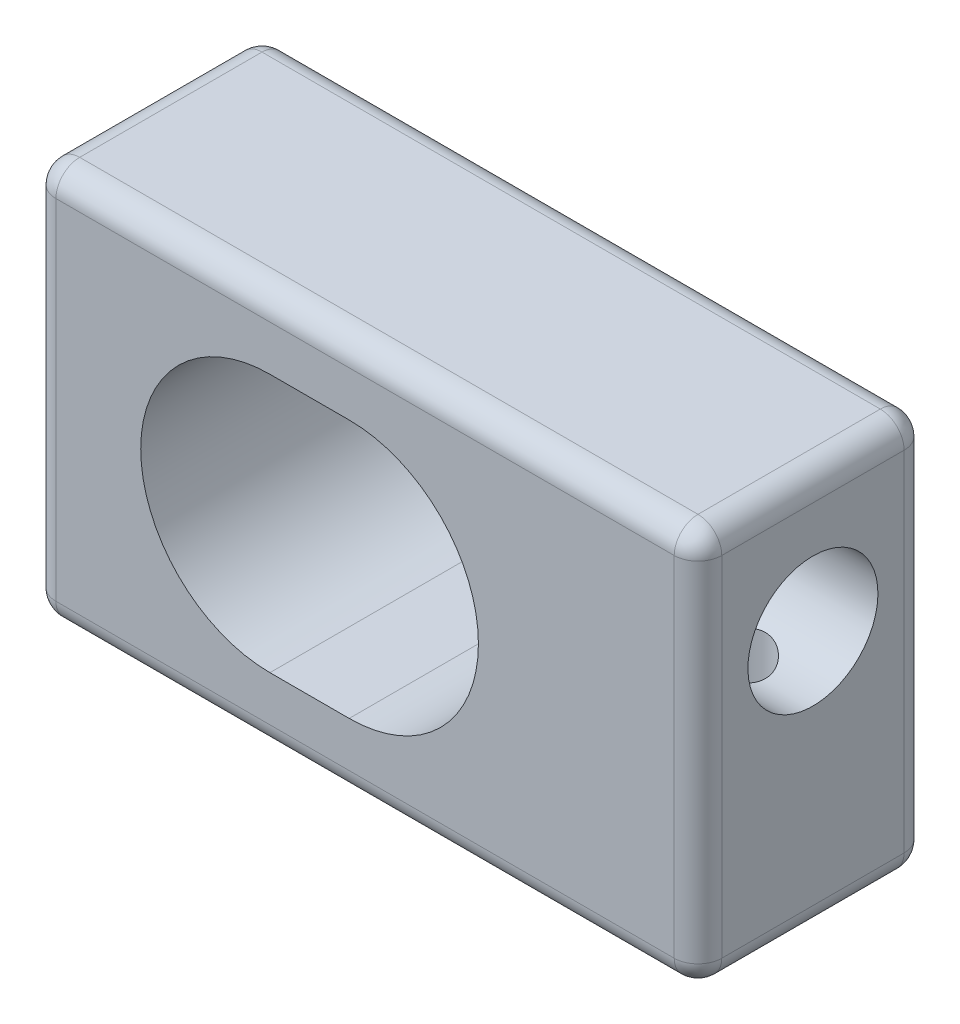
ISO-10303-21;
HEADER;
FILE_DESCRIPTION(('STEP AP214'),'2;1');
FILE_NAME('part.step','',(''),(''),'','','');
FILE_SCHEMA(('AUTOMOTIVE_DESIGN { 1 0 10303 214 1 1 1 1 }'));
ENDSEC;
DATA;
#1=APPLICATION_CONTEXT('core data for automotive mechanical design processes');
#2=APPLICATION_PROTOCOL_DEFINITION('international standard','automotive_design',2000,#1);
#3=PRODUCT_CONTEXT('',#1,'mechanical');
#4=PRODUCT('Part','Part','',(#3));
#5=PRODUCT_RELATED_PRODUCT_CATEGORY('part','',(#4));
#6=PRODUCT_DEFINITION_FORMATION('','',#4);
#7=PRODUCT_DEFINITION_CONTEXT('part definition',#1,'design');
#8=PRODUCT_DEFINITION('design','',#6,#7);
#9=PRODUCT_DEFINITION_SHAPE('','',#8);
#10=(LENGTH_UNIT() NAMED_UNIT(*) SI_UNIT(.MILLI.,.METRE.));
#11=(NAMED_UNIT(*) PLANE_ANGLE_UNIT() SI_UNIT($,.RADIAN.));
#12=(NAMED_UNIT(*) SI_UNIT($,.STERADIAN.) SOLID_ANGLE_UNIT());
#13=UNCERTAINTY_MEASURE_WITH_UNIT(LENGTH_MEASURE(1.E-05),#10,'distance_accuracy_value','');
#14=(GEOMETRIC_REPRESENTATION_CONTEXT(3) GLOBAL_UNCERTAINTY_ASSIGNED_CONTEXT((#13)) GLOBAL_UNIT_ASSIGNED_CONTEXT((#10,
#11,#12)) REPRESENTATION_CONTEXT('',''));
#15=CARTESIAN_POINT('',(0.,0.,0.));
#16=DIRECTION('',(0.,0.,1.));
#17=DIRECTION('',(1.,0.,0.));
#18=AXIS2_PLACEMENT_3D('',#15,#16,#17);
#19=CARTESIAN_POINT('',(-35.,3.99999999999999,0.));
#20=DIRECTION('',(1.,0.,0.));
#21=DIRECTION('',(0.,1.,0.));
#22=AXIS2_PLACEMENT_3D('',#19,#20,#21);
#23=CYLINDRICAL_SURFACE('',#22,4.1);
#24=CARTESIAN_POINT('',(-35.,3.99999999999999,0.));
#25=DIRECTION('',(1.,0.,0.));
#26=DIRECTION('',(0.,1.,0.));
#27=AXIS2_PLACEMENT_3D('',#24,#25,#26);
#28=CIRCLE('',#27,4.1);
#29=CARTESIAN_POINT('',(-35.,8.09999999999999,0.));
#30=VERTEX_POINT('',#29);
#31=EDGE_CURVE('E174',#30,#30,#28,.T.);
#32=ORIENTED_EDGE('',*,*,#31,.F.);
#33=EDGE_LOOP('',(#32));
#34=FACE_BOUND('',#33,.T.);
#35=CARTESIAN_POINT('',(-23.,4.,0.));
#36=DIRECTION('',(1.,0.,0.));
#37=DIRECTION('',(0.,1.,0.));
#38=AXIS2_PLACEMENT_3D('',#35,#36,#37);
#39=CIRCLE('',#38,4.1);
#40=CARTESIAN_POINT('',(-23.,8.1,0.));
#41=VERTEX_POINT('',#40);
#42=EDGE_CURVE('E206',#41,#41,#39,.T.);
#43=ORIENTED_EDGE('',*,*,#42,.T.);
#44=EDGE_LOOP('',(#43));
#45=FACE_BOUND('',#44,.T.);
#46=CARTESIAN_POINT('',(-28.,0.420893966365342,-2.));
#47=CARTESIAN_POINT('',(-28.1046031312725,0.42088450648062,-1.99999203521137));
#48=CARTESIAN_POINT('',(-28.2093511033945,0.416238741594833,-1.99173874982166));
#49=CARTESIAN_POINT('',(-28.4156613049539,0.398314840825055,-1.95912946894205));
#50=CARTESIAN_POINT('',(-28.5172159987745,0.385017688979334,-1.93473799932171));
#51=CARTESIAN_POINT('',(-28.7137725061673,0.351695686234525,-1.87113477427496));
#52=CARTESIAN_POINT('',(-28.8088049497837,0.331705308185981,-1.83199883213511));
#53=CARTESIAN_POINT('',(-28.9909318594943,0.287302034174977,-1.74024799841703));
#54=CARTESIAN_POINT('',(-29.0780262326005,0.262889086415728,-1.68763294896955));
#55=CARTESIAN_POINT('',(-29.2493433023785,0.210052370329995,-1.56558293033315));
#56=CARTESIAN_POINT('',(-29.3328072122269,0.181464228208256,-1.49515355486));
#57=CARTESIAN_POINT('',(-29.4873240306054,0.124827938574249,-1.34154519168278));
#58=CARTESIAN_POINT('',(-29.5583709971796,0.0967800552765653,-1.25836013547559));
#59=CARTESIAN_POINT('',(-29.6904395124954,0.0422559112787271,-1.07515162671652));
#60=CARTESIAN_POINT('',(-29.7505398545859,0.0159920363469842,-0.974394981339269));
#61=CARTESIAN_POINT('',(-29.85259316855,-0.0298904380465804,-0.762680850328953));
#62=CARTESIAN_POINT('',(-29.8945570528376,-0.0495130319139707,-0.651729547528794));
#63=CARTESIAN_POINT('',(-29.9561813505541,-0.0787206237004419,-0.430804292426904));
#64=CARTESIAN_POINT('',(-29.9771688968046,-0.0888994580161855,-0.321280788621113));
#65=CARTESIAN_POINT('',(-30.0006026099949,-0.100280364746837,-0.0998294816190968));
#66=CARTESIAN_POINT('',(-30.003059381806,-0.101487571477558,0.0120969096544417));
#67=CARTESIAN_POINT('',(-29.9899029762825,-0.095081612020624,0.225251375571964));
#68=CARTESIAN_POINT('',(-29.9757703352434,-0.0881910759698528,0.326597393919669));
#69=CARTESIAN_POINT('',(-29.9324682424626,-0.0674406457933107,0.525265987252534));
#70=CARTESIAN_POINT('',(-29.9032976695033,-0.053580232000275,0.62258826164565));
#71=CARTESIAN_POINT('',(-29.8305242701898,-0.0199212488693596,0.812185586111153));
#72=CARTESIAN_POINT('',(-29.7867208177783,-4.05126707999873E-05,0.904368438528107));
#73=CARTESIAN_POINT('',(-29.6861846505913,0.0438434063759527,1.08030473735587));
#74=CARTESIAN_POINT('',(-29.629447244431,0.0678480842739406,1.16405510921946));
#75=CARTESIAN_POINT('',(-29.4987043286489,0.120282427987117,1.32888526806238));
#76=CARTESIAN_POINT('',(-29.4235965795906,0.148915990270962,1.40902672648122));
#77=CARTESIAN_POINT('',(-29.2612141746693,0.205941185577788,1.55606875729569));
#78=CARTESIAN_POINT('',(-29.1739310113431,0.234332634578314,1.62295999143291));
#79=CARTESIAN_POINT('',(-28.9834283131435,0.289426721688105,1.74539879244378));
#80=CARTESIAN_POINT('',(-28.8795767875423,0.315934778736237,1.80005910768764));
#81=CARTESIAN_POINT('',(-28.66254531299,0.361624339903499,1.89072122831643));
#82=CARTESIAN_POINT('',(-28.5493748272999,0.38081316770062,1.92674169782093));
#83=CARTESIAN_POINT('',(-28.3262170381446,0.407628177528897,1.9762603767883));
#84=CARTESIAN_POINT('',(-28.216667887489,0.416038262776381,1.99129373139044));
#85=CARTESIAN_POINT('',(-27.9963141639717,0.42258189009715,2.00303207769182));
#86=CARTESIAN_POINT('',(-27.8855104287216,0.420721926739085,1.99974865253435));
#87=CARTESIAN_POINT('',(-27.6777784001529,0.407764713631274,1.97635544891226));
#88=CARTESIAN_POINT('',(-27.5805844794752,0.397625549218385,1.95798980802438));
#89=CARTESIAN_POINT('',(-27.3908247068405,0.370638900912599,1.90749863988995));
#90=CARTESIAN_POINT('',(-27.2982602771343,0.353789369568627,1.87536891275175));
#91=CARTESIAN_POINT('',(-27.1155148854361,0.314356068437624,1.79667570758734));
#92=CARTESIAN_POINT('',(-27.0256441457537,0.291542376463337,1.74951132085546));
#93=CARTESIAN_POINT('',(-26.8545821910222,0.242974359139307,1.64262069707828));
#94=CARTESIAN_POINT('',(-26.7733954253632,0.217218540180939,1.58288806653124));
#95=CARTESIAN_POINT('',(-26.6119224969456,0.161988276190041,1.44425233541738));
#96=CARTESIAN_POINT('',(-26.5328890101139,0.132435544909155,1.36391485049048));
#97=CARTESIAN_POINT('',(-26.3890577757458,0.0756191529476564,1.1906082774667));
#98=CARTESIAN_POINT('',(-26.3242641198842,0.0483561515850631,1.09763557115075));
#99=CARTESIAN_POINT('',(-26.2096103979044,-0.00159602312270822,0.89885628457633));
#100=CARTESIAN_POINT('',(-26.1601053926224,-0.0241729471476348,0.792814745687152));
#101=CARTESIAN_POINT('',(-26.0801158698428,-0.0613657595981733,0.572492505839614));
#102=CARTESIAN_POINT('',(-26.0496154549233,-0.0759883005958989,0.458218780662892));
#103=CARTESIAN_POINT('',(-26.0110099743409,-0.0946095016729402,0.235637779143145));
#104=CARTESIAN_POINT('',(-26.0011560842486,-0.0994365534491553,0.12770230974768));
#105=CARTESIAN_POINT('',(-25.9990373235048,-0.100469103195134,-0.0883674499714231));
#106=CARTESIAN_POINT('',(-26.0067668824825,-0.0966773315761714,-0.196501666488735));
#107=CARTESIAN_POINT('',(-26.0384085082158,-0.0813808629210031,-0.403000999714162));
#108=CARTESIAN_POINT('',(-26.0613090069554,-0.070358698032761,-0.50156052215356));
#109=CARTESIAN_POINT('',(-26.1213208863698,-0.0421202407472661,-0.693297406779022));
#110=CARTESIAN_POINT('',(-26.1584344020142,-0.0249030177997953,-0.78647395795567));
#111=CARTESIAN_POINT('',(-26.2475467579605,0.0150984854756035,-0.96938710744483));
#112=CARTESIAN_POINT('',(-26.3001285845863,0.0380943432643267,-1.05879207441146));
#113=CARTESIAN_POINT('',(-26.4179383301594,0.0871939300788347,-1.22789007126321));
#114=CARTESIAN_POINT('',(-26.4831720692979,0.113299087317954,-1.30757860376514));
#115=CARTESIAN_POINT('',(-26.6316603081963,0.168919234158771,-1.46296322006606));
#116=CARTESIAN_POINT('',(-26.7160390337754,0.198522285201071,-1.53755746285946));
#117=CARTESIAN_POINT('',(-26.8966151527309,0.255656353469566,-1.67189420349917));
#118=CARTESIAN_POINT('',(-26.9928220687854,0.283185672033318,-1.73162461618753));
#119=CARTESIAN_POINT('',(-27.1976998870936,0.333440532034785,-1.83569855861032));
#120=CARTESIAN_POINT('',(-27.3066179671409,0.35603220676816,-1.87963029930496));
#121=CARTESIAN_POINT('',(-27.4752521582704,0.383058842513929,-1.93082838173293));
#122=CARTESIAN_POINT('',(-27.5322852370427,0.390920182330383,-1.94543783106175));
#123=CARTESIAN_POINT('',(-27.6476908702184,0.404051075848943,-1.969605058563));
#124=CARTESIAN_POINT('',(-27.7060624412519,0.409322472281107,-1.97916642877747));
#125=CARTESIAN_POINT('',(-27.8037857828507,0.415730765501439,-1.99073876092795));
#126=CARTESIAN_POINT('',(-27.8429200708939,0.417662262836336,-1.99420822373664));
#127=CARTESIAN_POINT('',(-27.9213627405276,0.420245681261091,-1.99884041200608));
#128=CARTESIAN_POINT('',(-27.9606711327483,0.420897523109255,-2.00000299461509));
#129=CARTESIAN_POINT('',(-28.,0.420893966365342,-2.));
#130=B_SPLINE_CURVE_WITH_KNOTS('',3,(#46,#47,#48,#49,#50,#51,#52,#53,#54,#55,#56,#57,#58,#59,
#60,#61,#62,#63,#64,#65,#66,#67,#68,#69,#70,#71,#72,#73,#74,#75,#76,#77,#78,#79,#80,#81,#82,#83,
#84,#85,#86,#87,#88,#89,#90,#91,#92,#93,#94,#95,#96,#97,#98,#99,#100,#101,#102,#103,#104,#105,
#106,#107,#108,#109,#110,#111,#112,#113,#114,#115,#116,#117,#118,#119,#120,#121,#122,#123,#124,
#125,#126,#127,#128,#129),.UNSPECIFIED.,.T.,.F.,(4,2,2,2,2,2,2,2,2,2,2,2,2,2,2,2,2,2,2,2,2,2,2,
2,2,2,2,2,2,2,2,2,2,2,2,2,2,2,2,2,2,4),(0.,0.313650890541299,0.627993533225419,
0.940741468656524,1.25349306720364,1.5907325199367,1.92813291467276,2.28692480669026,
2.64550051785587,2.97959497055995,3.31349821173605,3.61973181129305,3.92598824671371,
4.23662887726974,4.54738236272927,4.88644508088655,5.22574591406522,5.58480245391706,
5.94349877057149,6.27426859261932,6.60482926656362,6.90179199962347,7.198845410745,
7.50969135282917,7.82069580710553,8.16864543025317,8.51669490295159,8.87230668332234,
9.22762059213176,9.55136951175943,9.8750158832254,10.1790016024625,10.4830330020054,
10.8004387428757,11.1179908460249,11.4657662790126,11.8138235565093,12.1703884153887,
12.3483459844256,12.5261767536391,12.6440964591989,12.7620234666165),.UNSPECIFIED.);
#131=CARTESIAN_POINT('',(-28.,0.420893966365342,-2.));
#132=VERTEX_POINT('',#131);
#133=EDGE_CURVE('E198',#132,#132,#130,.T.);
#134=ORIENTED_EDGE('',*,*,#133,.F.);
#135=EDGE_LOOP('',(#134));
#136=FACE_BOUND('',#135,.T.);
#137=ADVANCED_FACE('F39',(#34,#45,#136),#23,.F.);
#138=CARTESIAN_POINT('',(-65.,12.5,-7.25));
#139=DIRECTION('',(-1.,0.,0.));
#140=DIRECTION('',(0.,0.,1.));
#141=AXIS2_PLACEMENT_3D('',#138,#139,#140);
#142=PLANE('',#141);
#143=DIRECTION('',(0.,0.,1.));
#144=VECTOR('',#143,1.);
#145=CARTESIAN_POINT('',(-65.,11.,-7.25));
#146=LINE('',#145,#144);
#147=CARTESIAN_POINT('',(-65.,11.,5.75));
#148=VERTEX_POINT('',#147);
#149=CARTESIAN_POINT('',(-65.,11.,-5.75));
#150=VERTEX_POINT('',#149);
#151=EDGE_CURVE('E362',#148,#150,#146,.F.);
#152=ORIENTED_EDGE('',*,*,#151,.T.);
#153=DIRECTION('',(0.,-1.,0.));
#154=VECTOR('',#153,1.);
#155=CARTESIAN_POINT('',(-65.,-12.5,-5.75));
#156=LINE('',#155,#154);
#157=CARTESIAN_POINT('',(-65.,-11.,-5.75));
#158=VERTEX_POINT('',#157);
#159=EDGE_CURVE('E359',#150,#158,#156,.T.);
#160=ORIENTED_EDGE('',*,*,#159,.T.);
#161=DIRECTION('',(0.,0.,1.));
#162=VECTOR('',#161,1.);
#163=CARTESIAN_POINT('',(-65.,-11.,-7.25));
#164=LINE('',#163,#162);
#165=CARTESIAN_POINT('',(-65.,-11.,5.75));
#166=VERTEX_POINT('',#165);
#167=EDGE_CURVE('E194',#158,#166,#164,.T.);
#168=ORIENTED_EDGE('',*,*,#167,.T.);
#169=DIRECTION('',(0.,-1.,0.));
#170=VECTOR('',#169,1.);
#171=CARTESIAN_POINT('',(-65.,12.5,5.75));
#172=LINE('',#171,#170);
#173=EDGE_CURVE('E363',#166,#148,#172,.F.);
#174=ORIENTED_EDGE('',*,*,#173,.T.);
#175=EDGE_LOOP('',(#152,#160,#168,#174));
#176=FACE_BOUND('',#175,.T.);
#177=ADVANCED_FACE('F226',(#176),#142,.T.);
#178=CARTESIAN_POINT('',(-65.,12.5,-7.25));
#179=DIRECTION('',(0.,1.,0.));
#180=DIRECTION('',(-1.,0.,0.));
#181=AXIS2_PLACEMENT_3D('',#178,#179,#180);
#182=PLANE('',#181);
#183=DIRECTION('',(-1.,0.,0.));
#184=VECTOR('',#183,1.);
#185=CARTESIAN_POINT('',(-65.,12.5,-5.75));
#186=LINE('',#185,#184);
#187=CARTESIAN_POINT('',(-24.5,12.5,-5.75));
#188=VERTEX_POINT('',#187);
#189=CARTESIAN_POINT('',(-63.5,12.5,-5.75));
#190=VERTEX_POINT('',#189);
#191=EDGE_CURVE('E344',#188,#190,#186,.T.);
#192=ORIENTED_EDGE('',*,*,#191,.T.);
#193=DIRECTION('',(0.,0.,1.));
#194=VECTOR('',#193,1.);
#195=CARTESIAN_POINT('',(-63.5,12.5,-7.25));
#196=LINE('',#195,#194);
#197=CARTESIAN_POINT('',(-63.5,12.5,5.75));
#198=VERTEX_POINT('',#197);
#199=EDGE_CURVE('E341',#190,#198,#196,.T.);
#200=ORIENTED_EDGE('',*,*,#199,.T.);
#201=DIRECTION('',(-1.,0.,0.));
#202=VECTOR('',#201,1.);
#203=CARTESIAN_POINT('',(-65.,12.5,5.75));
#204=LINE('',#203,#202);
#205=CARTESIAN_POINT('',(-24.5,12.5,5.75));
#206=VERTEX_POINT('',#205);
#207=EDGE_CURVE('E346',#198,#206,#204,.F.);
#208=ORIENTED_EDGE('',*,*,#207,.T.);
#209=DIRECTION('',(0.,0.,1.));
#210=VECTOR('',#209,1.);
#211=CARTESIAN_POINT('',(-24.5,12.5,-7.25));
#212=LINE('',#211,#210);
#213=EDGE_CURVE('E348',#206,#188,#212,.F.);
#214=ORIENTED_EDGE('',*,*,#213,.T.);
#215=EDGE_LOOP('',(#192,#200,#208,#214));
#216=FACE_BOUND('',#215,.T.);
#217=ADVANCED_FACE('F231',(#216),#182,.T.);
#218=CARTESIAN_POINT('',(-23.,12.5,-7.25));
#219=DIRECTION('',(1.,0.,0.));
#220=DIRECTION('',(0.,1.,0.));
#221=AXIS2_PLACEMENT_3D('',#218,#219,#220);
#222=PLANE('',#221);
#223=DIRECTION('',(0.,1.,0.));
#224=VECTOR('',#223,1.);
#225=CARTESIAN_POINT('',(-23.,12.5,5.75));
#226=LINE('',#225,#224);
#227=CARTESIAN_POINT('',(-23.,11.,5.75));
#228=VERTEX_POINT('',#227);
#229=CARTESIAN_POINT('',(-23.,-11.,5.75));
#230=VERTEX_POINT('',#229);
#231=EDGE_CURVE('E48',#228,#230,#226,.F.);
#232=ORIENTED_EDGE('',*,*,#231,.T.);
#233=DIRECTION('',(0.,0.,1.));
#234=VECTOR('',#233,1.);
#235=CARTESIAN_POINT('',(-23.,-11.,-7.25));
#236=LINE('',#235,#234);
#237=CARTESIAN_POINT('',(-23.,-11.,-5.75));
#238=VERTEX_POINT('',#237);
#239=EDGE_CURVE('E11',#230,#238,#236,.F.);
#240=ORIENTED_EDGE('',*,*,#239,.T.);
#241=DIRECTION('',(0.,1.,0.));
#242=VECTOR('',#241,1.);
#243=CARTESIAN_POINT('',(-23.,12.5,-5.75));
#244=LINE('',#243,#242);
#245=CARTESIAN_POINT('',(-23.,11.,-5.75));
#246=VERTEX_POINT('',#245);
#247=EDGE_CURVE('E319',#238,#246,#244,.T.);
#248=ORIENTED_EDGE('',*,*,#247,.T.);
#249=DIRECTION('',(0.,0.,1.));
#250=VECTOR('',#249,1.);
#251=CARTESIAN_POINT('',(-23.,11.,-7.25));
#252=LINE('',#251,#250);
#253=EDGE_CURVE('E321',#246,#228,#252,.T.);
#254=ORIENTED_EDGE('',*,*,#253,.T.);
#255=EDGE_LOOP('',(#232,#240,#248,#254));
#256=FACE_BOUND('',#255,.T.);
#257=ORIENTED_EDGE('',*,*,#42,.F.);
#258=EDGE_LOOP('',(#257));
#259=FACE_BOUND('',#258,.T.);
#260=ADVANCED_FACE('F475',(#256,#259),#222,.T.);
#261=CARTESIAN_POINT('',(-65.,-12.5,-7.25));
#262=DIRECTION('',(0.,-1.,0.));
#263=DIRECTION('',(0.,0.,-1.));
#264=AXIS2_PLACEMENT_3D('',#261,#262,#263);
#265=PLANE('',#264);
#266=DIRECTION('',(1.,0.,0.));
#267=VECTOR('',#266,1.);
#268=CARTESIAN_POINT('',(-65.,-12.5,5.75));
#269=LINE('',#268,#267);
#270=CARTESIAN_POINT('',(-24.5,-12.5,5.75));
#271=VERTEX_POINT('',#270);
#272=CARTESIAN_POINT('',(-63.5,-12.5,5.75));
#273=VERTEX_POINT('',#272);
#274=EDGE_CURVE('E328',#271,#273,#269,.F.);
#275=ORIENTED_EDGE('',*,*,#274,.T.);
#276=DIRECTION('',(0.,0.,1.));
#277=VECTOR('',#276,1.);
#278=CARTESIAN_POINT('',(-63.5,-12.5,-7.25));
#279=LINE('',#278,#277);
#280=CARTESIAN_POINT('',(-63.5,-12.5,-5.75));
#281=VERTEX_POINT('',#280);
#282=EDGE_CURVE('E323',#273,#281,#279,.F.);
#283=ORIENTED_EDGE('',*,*,#282,.T.);
#284=DIRECTION('',(1.,0.,0.));
#285=VECTOR('',#284,1.);
#286=CARTESIAN_POINT('',(-23.,-12.5,-5.75));
#287=LINE('',#286,#285);
#288=CARTESIAN_POINT('',(-24.5,-12.5,-5.75));
#289=VERTEX_POINT('',#288);
#290=EDGE_CURVE('E326',#281,#289,#287,.T.);
#291=ORIENTED_EDGE('',*,*,#290,.T.);
#292=DIRECTION('',(0.,0.,1.));
#293=VECTOR('',#292,1.);
#294=CARTESIAN_POINT('',(-24.5,-12.5,-7.25));
#295=LINE('',#294,#293);
#296=EDGE_CURVE('E330',#289,#271,#295,.T.);
#297=ORIENTED_EDGE('',*,*,#296,.T.);
#298=EDGE_LOOP('',(#275,#283,#291,#297));
#299=FACE_BOUND('',#298,.T.);
#300=CARTESIAN_POINT('',(-28.,-12.5,0.));
#301=DIRECTION('',(0.,1.,0.));
#302=DIRECTION('',(0.,0.,1.));
#303=AXIS2_PLACEMENT_3D('',#300,#301,#302);
#304=CIRCLE('',#303,2.);
#305=CARTESIAN_POINT('',(-28.,-12.5,2.));
#306=VERTEX_POINT('',#305);
#307=EDGE_CURVE('E207',#306,#306,#304,.T.);
#308=ORIENTED_EDGE('',*,*,#307,.T.);
#309=EDGE_LOOP('',(#308));
#310=FACE_BOUND('',#309,.T.);
#311=ADVANCED_FACE('F384',(#299,#310),#265,.T.);
#312=CARTESIAN_POINT('',(0.,0.,-7.25));
#313=DIRECTION('',(0.,0.,1.));
#314=DIRECTION('',(1.,0.,0.));
#315=AXIS2_PLACEMENT_3D('',#312,#313,#314);
#316=PLANE('',#315);
#317=DIRECTION('',(1.,0.,0.));
#318=VECTOR('',#317,1.);
#319=CARTESIAN_POINT('',(-65.,-11.,-7.25));
#320=LINE('',#319,#318);
#321=CARTESIAN_POINT('',(-24.5,-11.,-7.25));
#322=VERTEX_POINT('',#321);
#323=CARTESIAN_POINT('',(-63.5,-11.,-7.25));
#324=VERTEX_POINT('',#323);
#325=EDGE_CURVE('E357',#322,#324,#320,.F.);
#326=ORIENTED_EDGE('',*,*,#325,.T.);
#327=DIRECTION('',(0.,-1.,0.));
#328=VECTOR('',#327,1.);
#329=CARTESIAN_POINT('',(-63.5,12.5,-7.25));
#330=LINE('',#329,#328);
#331=CARTESIAN_POINT('',(-63.5,11.,-7.25));
#332=VERTEX_POINT('',#331);
#333=EDGE_CURVE('E350',#324,#332,#330,.F.);
#334=ORIENTED_EDGE('',*,*,#333,.T.);
#335=DIRECTION('',(-1.,0.,0.));
#336=VECTOR('',#335,1.);
#337=CARTESIAN_POINT('',(-23.,11.,-7.25));
#338=LINE('',#337,#336);
#339=CARTESIAN_POINT('',(-24.5,11.,-7.25));
#340=VERTEX_POINT('',#339);
#341=EDGE_CURVE('E353',#332,#340,#338,.F.);
#342=ORIENTED_EDGE('',*,*,#341,.T.);
#343=DIRECTION('',(0.,1.,0.));
#344=VECTOR('',#343,1.);
#345=CARTESIAN_POINT('',(-24.5,-12.5,-7.25));
#346=LINE('',#345,#344);
#347=EDGE_CURVE('E355',#340,#322,#346,.F.);
#348=ORIENTED_EDGE('',*,*,#347,.T.);
#349=EDGE_LOOP('',(#326,#334,#342,#348));
#350=FACE_BOUND('',#349,.T.);
#351=DIRECTION('',(1.,0.,0.));
#352=VECTOR('',#351,1.);
#353=CARTESIAN_POINT('',(-45.,-8.15,-7.25));
#354=LINE('',#353,#352);
#355=CARTESIAN_POINT('',(-50.,-8.15,-7.25));
#356=VERTEX_POINT('',#355);
#357=CARTESIAN_POINT('',(-45.,-8.15,-7.25));
#358=VERTEX_POINT('',#357);
#359=EDGE_CURVE('E165',#356,#358,#354,.T.);
#360=ORIENTED_EDGE('',*,*,#359,.T.);
#361=CARTESIAN_POINT('',(-45.,0.,-7.25));
#362=DIRECTION('',(0.,0.,1.));
#363=DIRECTION('',(1.,0.,0.));
#364=AXIS2_PLACEMENT_3D('',#361,#362,#363);
#365=CIRCLE('',#364,8.15);
#366=CARTESIAN_POINT('',(-45.,8.15,-7.25));
#367=VERTEX_POINT('',#366);
#368=EDGE_CURVE('E185',#358,#367,#365,.T.);
#369=ORIENTED_EDGE('',*,*,#368,.T.);
#370=DIRECTION('',(-1.,0.,0.));
#371=VECTOR('',#370,1.);
#372=CARTESIAN_POINT('',(-45.,8.15,-7.25));
#373=LINE('',#372,#371);
#374=CARTESIAN_POINT('',(-50.,8.15,-7.25));
#375=VERTEX_POINT('',#374);
#376=EDGE_CURVE('E160',#367,#375,#373,.T.);
#377=ORIENTED_EDGE('',*,*,#376,.T.);
#378=CARTESIAN_POINT('',(-50.,0.,-7.25));
#379=DIRECTION('',(0.,0.,1.));
#380=DIRECTION('',(1.,0.,0.));
#381=AXIS2_PLACEMENT_3D('',#378,#379,#380);
#382=CIRCLE('',#381,8.15);
#383=EDGE_CURVE('E188',#375,#356,#382,.T.);
#384=ORIENTED_EDGE('',*,*,#383,.T.);
#385=EDGE_LOOP('',(#360,#369,#377,#384));
#386=FACE_BOUND('',#385,.T.);
#387=ADVANCED_FACE('F474',(#350,#386),#316,.F.);
#388=CARTESIAN_POINT('',(-45.,0.,-7.25));
#389=DIRECTION('',(0.,0.,1.));
#390=DIRECTION('',(1.,0.,0.));
#391=AXIS2_PLACEMENT_3D('',#388,#389,#390);
#392=CYLINDRICAL_SURFACE('',#391,8.15);
#393=DIRECTION('',(0.,0.,1.));
#394=VECTOR('',#393,1.);
#395=CARTESIAN_POINT('',(-45.,-8.15,-7.25));
#396=LINE('',#395,#394);
#397=CARTESIAN_POINT('',(-45.,-8.15,7.25));
#398=VERTEX_POINT('',#397);
#399=EDGE_CURVE('E170',#358,#398,#396,.T.);
#400=ORIENTED_EDGE('',*,*,#399,.T.);
#401=CARTESIAN_POINT('',(-45.,0.,7.25));
#402=DIRECTION('',(0.,0.,1.));
#403=DIRECTION('',(1.,0.,0.));
#404=AXIS2_PLACEMENT_3D('',#401,#402,#403);
#405=CIRCLE('',#404,8.15);
#406=CARTESIAN_POINT('',(-45.,8.15,7.25));
#407=VERTEX_POINT('',#406);
#408=EDGE_CURVE('E168',#398,#407,#405,.T.);
#409=ORIENTED_EDGE('',*,*,#408,.T.);
#410=DIRECTION('',(0.,0.,1.));
#411=VECTOR('',#410,1.);
#412=CARTESIAN_POINT('',(-45.,8.15,-7.25));
#413=LINE('',#412,#411);
#414=EDGE_CURVE('E152',#367,#407,#413,.T.);
#415=ORIENTED_EDGE('',*,*,#414,.F.);
#416=ORIENTED_EDGE('',*,*,#368,.F.);
#417=EDGE_LOOP('',(#400,#409,#415,#416));
#418=FACE_BOUND('',#417,.T.);
#419=ADVANCED_FACE('F169',(#418),#392,.F.);
#420=CARTESIAN_POINT('',(-45.,-8.15,-7.25));
#421=DIRECTION('',(0.,-1.,0.));
#422=DIRECTION('',(1.,0.,0.));
#423=AXIS2_PLACEMENT_3D('',#420,#421,#422);
#424=PLANE('',#423);
#425=DIRECTION('',(0.,0.,1.));
#426=VECTOR('',#425,1.);
#427=CARTESIAN_POINT('',(-50.,-8.15,-7.25));
#428=LINE('',#427,#426);
#429=CARTESIAN_POINT('',(-50.,-8.15,7.25));
#430=VERTEX_POINT('',#429);
#431=EDGE_CURVE('E195',#356,#430,#428,.T.);
#432=ORIENTED_EDGE('',*,*,#431,.T.);
#433=DIRECTION('',(1.,0.,0.));
#434=VECTOR('',#433,1.);
#435=CARTESIAN_POINT('',(-45.,-8.15,7.25));
#436=LINE('',#435,#434);
#437=EDGE_CURVE('E180',#430,#398,#436,.T.);
#438=ORIENTED_EDGE('',*,*,#437,.T.);
#439=ORIENTED_EDGE('',*,*,#399,.F.);
#440=ORIENTED_EDGE('',*,*,#359,.F.);
#441=EDGE_LOOP('',(#432,#438,#439,#440));
#442=FACE_BOUND('',#441,.T.);
#443=ADVANCED_FACE('F486',(#442),#424,.F.);
#444=CARTESIAN_POINT('',(-50.,0.,-7.25));
#445=DIRECTION('',(0.,0.,1.));
#446=DIRECTION('',(1.,0.,0.));
#447=AXIS2_PLACEMENT_3D('',#444,#445,#446);
#448=CYLINDRICAL_SURFACE('',#447,8.15);
#449=DIRECTION('',(0.,0.,1.));
#450=VECTOR('',#449,1.);
#451=CARTESIAN_POINT('',(-50.,8.15,-7.25));
#452=LINE('',#451,#450);
#453=CARTESIAN_POINT('',(-50.,8.15,7.25));
#454=VERTEX_POINT('',#453);
#455=EDGE_CURVE('E164',#375,#454,#452,.T.);
#456=ORIENTED_EDGE('',*,*,#455,.T.);
#457=CARTESIAN_POINT('',(-50.,0.,7.25));
#458=DIRECTION('',(0.,0.,1.));
#459=DIRECTION('',(1.,0.,0.));
#460=AXIS2_PLACEMENT_3D('',#457,#458,#459);
#461=CIRCLE('',#460,8.15);
#462=EDGE_CURVE('E178',#454,#430,#461,.T.);
#463=ORIENTED_EDGE('',*,*,#462,.T.);
#464=ORIENTED_EDGE('',*,*,#431,.F.);
#465=ORIENTED_EDGE('',*,*,#383,.F.);
#466=EDGE_LOOP('',(#456,#463,#464,#465));
#467=FACE_BOUND('',#466,.T.);
#468=ADVANCED_FACE('F488',(#467),#448,.F.);
#469=CARTESIAN_POINT('',(-45.,8.15,-7.25));
#470=DIRECTION('',(0.,1.,0.));
#471=DIRECTION('',(-1.,0.,0.));
#472=AXIS2_PLACEMENT_3D('',#469,#470,#471);
#473=PLANE('',#472);
#474=ORIENTED_EDGE('',*,*,#414,.T.);
#475=DIRECTION('',(-1.,0.,0.));
#476=VECTOR('',#475,1.);
#477=CARTESIAN_POINT('',(-45.,8.15,7.25));
#478=LINE('',#477,#476);
#479=EDGE_CURVE('E157',#407,#454,#478,.T.);
#480=ORIENTED_EDGE('',*,*,#479,.T.);
#481=ORIENTED_EDGE('',*,*,#455,.F.);
#482=ORIENTED_EDGE('',*,*,#376,.F.);
#483=EDGE_LOOP('',(#474,#480,#481,#482));
#484=FACE_BOUND('',#483,.T.);
#485=ADVANCED_FACE('F154',(#484),#473,.F.);
#486=CARTESIAN_POINT('',(0.,0.,7.25));
#487=DIRECTION('',(0.,0.,1.));
#488=DIRECTION('',(1.,0.,0.));
#489=AXIS2_PLACEMENT_3D('',#486,#487,#488);
#490=PLANE('',#489);
#491=DIRECTION('',(0.,-1.,0.));
#492=VECTOR('',#491,1.);
#493=CARTESIAN_POINT('',(-63.5,0.,7.25));
#494=LINE('',#493,#492);
#495=CARTESIAN_POINT('',(-63.5,11.,7.25));
#496=VERTEX_POINT('',#495);
#497=CARTESIAN_POINT('',(-63.5,-11.,7.25));
#498=VERTEX_POINT('',#497);
#499=EDGE_CURVE('E334',#496,#498,#494,.T.);
#500=ORIENTED_EDGE('',*,*,#499,.T.);
#501=DIRECTION('',(1.,0.,0.));
#502=VECTOR('',#501,1.);
#503=CARTESIAN_POINT('',(0.,-11.,7.25));
#504=LINE('',#503,#502);
#505=CARTESIAN_POINT('',(-24.5,-11.,7.25));
#506=VERTEX_POINT('',#505);
#507=EDGE_CURVE('E332',#498,#506,#504,.T.);
#508=ORIENTED_EDGE('',*,*,#507,.T.);
#509=DIRECTION('',(0.,1.,0.));
#510=VECTOR('',#509,1.);
#511=CARTESIAN_POINT('',(-24.5,0.,7.25));
#512=LINE('',#511,#510);
#513=CARTESIAN_POINT('',(-24.5,11.,7.25));
#514=VERTEX_POINT('',#513);
#515=EDGE_CURVE('E337',#506,#514,#512,.T.);
#516=ORIENTED_EDGE('',*,*,#515,.T.);
#517=DIRECTION('',(-1.,0.,0.));
#518=VECTOR('',#517,1.);
#519=CARTESIAN_POINT('',(0.,11.,7.25));
#520=LINE('',#519,#518);
#521=EDGE_CURVE('E339',#514,#496,#520,.T.);
#522=ORIENTED_EDGE('',*,*,#521,.T.);
#523=EDGE_LOOP('',(#500,#508,#516,#522));
#524=FACE_BOUND('',#523,.T.);
#525=ORIENTED_EDGE('',*,*,#479,.F.);
#526=ORIENTED_EDGE('',*,*,#408,.F.);
#527=ORIENTED_EDGE('',*,*,#437,.F.);
#528=ORIENTED_EDGE('',*,*,#462,.F.);
#529=EDGE_LOOP('',(#525,#526,#527,#528));
#530=FACE_BOUND('',#529,.T.);
#531=ADVANCED_FACE('F176',(#524,#530),#490,.T.);
#532=CARTESIAN_POINT('',(-35.,3.99999999999999,0.));
#533=DIRECTION('',(1.,0.,0.));
#534=DIRECTION('',(0.,1.,0.));
#535=AXIS2_PLACEMENT_3D('',#532,#533,#534);
#536=PLANE('',#535);
#537=ORIENTED_EDGE('',*,*,#31,.T.);
#538=EDGE_LOOP('',(#537));
#539=FACE_BOUND('',#538,.T.);
#540=ADVANCED_FACE('F215',(#539),#536,.T.);
#541=CARTESIAN_POINT('',(-28.,2.5,0.));
#542=DIRECTION('',(0.,-1.,0.));
#543=DIRECTION('',(0.,0.,-1.));
#544=AXIS2_PLACEMENT_3D('',#541,#542,#543);
#545=CYLINDRICAL_SURFACE('',#544,2.);
#546=ORIENTED_EDGE('',*,*,#307,.F.);
#547=EDGE_LOOP('',(#546));
#548=FACE_BOUND('',#547,.T.);
#549=ORIENTED_EDGE('',*,*,#133,.T.);
#550=EDGE_LOOP('',(#549));
#551=FACE_BOUND('',#550,.T.);
#552=ADVANCED_FACE('F212',(#548,#551),#545,.F.);
#553=CARTESIAN_POINT('',(-24.5,0.,5.75));
#554=DIRECTION('',(0.,1.,0.));
#555=DIRECTION('',(-1.,0.,0.));
#556=AXIS2_PLACEMENT_3D('',#553,#554,#555);
#557=CYLINDRICAL_SURFACE('',#556,1.5);
#558=CARTESIAN_POINT('',(-24.5,11.,5.75));
#559=DIRECTION('',(0.,1.,0.));
#560=DIRECTION('',(0.,0.,1.));
#561=AXIS2_PLACEMENT_3D('',#558,#559,#560);
#562=CIRCLE('',#561,1.5);
#563=EDGE_CURVE('E43',#514,#228,#562,.T.);
#564=ORIENTED_EDGE('',*,*,#563,.F.);
#565=ORIENTED_EDGE('',*,*,#515,.F.);
#566=CARTESIAN_POINT('',(-24.5,-11.,5.75));
#567=DIRECTION('',(0.,-1.,0.));
#568=DIRECTION('',(0.,0.,-1.));
#569=AXIS2_PLACEMENT_3D('',#566,#567,#568);
#570=CIRCLE('',#569,1.5);
#571=EDGE_CURVE('E248',#230,#506,#570,.T.);
#572=ORIENTED_EDGE('',*,*,#571,.F.);
#573=ORIENTED_EDGE('',*,*,#231,.F.);
#574=EDGE_LOOP('',(#564,#565,#572,#573));
#575=FACE_BOUND('',#574,.T.);
#576=ADVANCED_FACE('F41',(#575),#557,.T.);
#577=CARTESIAN_POINT('',(-24.5,11.,5.75));
#578=DIRECTION('',(0.,0.,1.));
#579=DIRECTION('',(1.,0.,0.));
#580=AXIS2_PLACEMENT_3D('',#577,#578,#579);
#581=SPHERICAL_SURFACE('',#580,1.5);
#582=CARTESIAN_POINT('',(-24.5,11.,5.75));
#583=DIRECTION('',(1.,0.,0.));
#584=DIRECTION('',(0.,0.,-1.));
#585=AXIS2_PLACEMENT_3D('',#582,#583,#584);
#586=CIRCLE('',#585,1.5);
#587=EDGE_CURVE('E260',#514,#206,#586,.F.);
#588=ORIENTED_EDGE('',*,*,#587,.F.);
#589=ORIENTED_EDGE('',*,*,#563,.T.);
#590=CARTESIAN_POINT('',(-24.5,11.,5.75));
#591=DIRECTION('',(0.,0.,1.));
#592=DIRECTION('',(1.,0.,0.));
#593=AXIS2_PLACEMENT_3D('',#590,#591,#592);
#594=CIRCLE('',#593,1.5);
#595=EDGE_CURVE('E255',#206,#228,#594,.F.);
#596=ORIENTED_EDGE('',*,*,#595,.F.);
#597=EDGE_LOOP('',(#588,#589,#596));
#598=FACE_BOUND('',#597,.T.);
#599=ADVANCED_FACE('F425',(#598),#581,.T.);
#600=CARTESIAN_POINT('',(-24.5,-11.,5.75));
#601=DIRECTION('',(0.,0.,1.));
#602=DIRECTION('',(1.,0.,0.));
#603=AXIS2_PLACEMENT_3D('',#600,#601,#602);
#604=SPHERICAL_SURFACE('',#603,1.5);
#605=CARTESIAN_POINT('',(-24.5,-11.,5.75));
#606=DIRECTION('',(0.,0.,1.));
#607=DIRECTION('',(1.,0.,0.));
#608=AXIS2_PLACEMENT_3D('',#605,#606,#607);
#609=CIRCLE('',#608,1.5);
#610=EDGE_CURVE('E267',#230,#271,#609,.F.);
#611=ORIENTED_EDGE('',*,*,#610,.F.);
#612=ORIENTED_EDGE('',*,*,#571,.T.);
#613=CARTESIAN_POINT('',(-24.5,-11.,5.75));
#614=DIRECTION('',(1.,0.,0.));
#615=DIRECTION('',(0.,1.,0.));
#616=AXIS2_PLACEMENT_3D('',#613,#614,#615);
#617=CIRCLE('',#616,1.5);
#618=EDGE_CURVE('E265',#271,#506,#617,.F.);
#619=ORIENTED_EDGE('',*,*,#618,.F.);
#620=EDGE_LOOP('',(#611,#612,#619));
#621=FACE_BOUND('',#620,.T.);
#622=ADVANCED_FACE('F422',(#621),#604,.T.);
#623=CARTESIAN_POINT('',(-24.5,11.,-7.25));
#624=DIRECTION('',(0.,0.,1.));
#625=DIRECTION('',(1.,0.,0.));
#626=AXIS2_PLACEMENT_3D('',#623,#624,#625);
#627=CYLINDRICAL_SURFACE('',#626,1.5);
#628=ORIENTED_EDGE('',*,*,#595,.T.);
#629=ORIENTED_EDGE('',*,*,#253,.F.);
#630=CARTESIAN_POINT('',(-24.5,11.,-5.75));
#631=DIRECTION('',(0.,0.,-1.));
#632=DIRECTION('',(-1.,0.,0.));
#633=AXIS2_PLACEMENT_3D('',#630,#631,#632);
#634=CIRCLE('',#633,1.5);
#635=EDGE_CURVE('E272',#188,#246,#634,.T.);
#636=ORIENTED_EDGE('',*,*,#635,.F.);
#637=ORIENTED_EDGE('',*,*,#213,.F.);
#638=EDGE_LOOP('',(#628,#629,#636,#637));
#639=FACE_BOUND('',#638,.T.);
#640=ADVANCED_FACE('F424',(#639),#627,.T.);
#641=CARTESIAN_POINT('',(0.,11.,5.75));
#642=DIRECTION('',(-1.,0.,0.));
#643=DIRECTION('',(0.,-1.,0.));
#644=AXIS2_PLACEMENT_3D('',#641,#642,#643);
#645=CYLINDRICAL_SURFACE('',#644,1.5);
#646=ORIENTED_EDGE('',*,*,#587,.T.);
#647=ORIENTED_EDGE('',*,*,#207,.F.);
#648=CARTESIAN_POINT('',(-63.5,11.,5.75));
#649=DIRECTION('',(-1.,0.,0.));
#650=DIRECTION('',(0.,0.,1.));
#651=AXIS2_PLACEMENT_3D('',#648,#649,#650);
#652=CIRCLE('',#651,1.5);
#653=EDGE_CURVE('E275',#496,#198,#652,.T.);
#654=ORIENTED_EDGE('',*,*,#653,.F.);
#655=ORIENTED_EDGE('',*,*,#521,.F.);
#656=EDGE_LOOP('',(#646,#647,#654,#655));
#657=FACE_BOUND('',#656,.T.);
#658=ADVANCED_FACE('F394',(#657),#645,.T.);
#659=CARTESIAN_POINT('',(-63.5,0.,5.75));
#660=DIRECTION('',(0.,-1.,0.));
#661=DIRECTION('',(0.,0.,-1.));
#662=AXIS2_PLACEMENT_3D('',#659,#660,#661);
#663=CYLINDRICAL_SURFACE('',#662,1.5);
#664=CARTESIAN_POINT('',(-63.5,-11.,5.75));
#665=DIRECTION('',(0.,-1.,0.));
#666=DIRECTION('',(1.,0.,0.));
#667=AXIS2_PLACEMENT_3D('',#664,#665,#666);
#668=CIRCLE('',#667,1.5);
#669=EDGE_CURVE('E281',#498,#166,#668,.T.);
#670=ORIENTED_EDGE('',*,*,#669,.F.);
#671=ORIENTED_EDGE('',*,*,#499,.F.);
#672=CARTESIAN_POINT('',(-63.5,11.,5.75));
#673=DIRECTION('',(0.,1.,0.));
#674=DIRECTION('',(0.,0.,1.));
#675=AXIS2_PLACEMENT_3D('',#672,#673,#674);
#676=CIRCLE('',#675,1.5);
#677=EDGE_CURVE('E278',#148,#496,#676,.T.);
#678=ORIENTED_EDGE('',*,*,#677,.F.);
#679=ORIENTED_EDGE('',*,*,#173,.F.);
#680=EDGE_LOOP('',(#670,#671,#678,#679));
#681=FACE_BOUND('',#680,.T.);
#682=ADVANCED_FACE('F372',(#681),#663,.T.);
#683=CARTESIAN_POINT('',(0.,-11.,5.75));
#684=DIRECTION('',(1.,0.,0.));
#685=DIRECTION('',(0.,0.,-1.));
#686=AXIS2_PLACEMENT_3D('',#683,#684,#685);
#687=CYLINDRICAL_SURFACE('',#686,1.5);
#688=ORIENTED_EDGE('',*,*,#618,.T.);
#689=ORIENTED_EDGE('',*,*,#507,.F.);
#690=CARTESIAN_POINT('',(-63.5,-11.,5.75));
#691=DIRECTION('',(-1.,0.,0.));
#692=DIRECTION('',(0.,0.,1.));
#693=AXIS2_PLACEMENT_3D('',#690,#691,#692);
#694=CIRCLE('',#693,1.5);
#695=EDGE_CURVE('E284',#273,#498,#694,.T.);
#696=ORIENTED_EDGE('',*,*,#695,.F.);
#697=ORIENTED_EDGE('',*,*,#274,.F.);
#698=EDGE_LOOP('',(#688,#689,#696,#697));
#699=FACE_BOUND('',#698,.T.);
#700=ADVANCED_FACE('F388',(#699),#687,.T.);
#701=CARTESIAN_POINT('',(-24.5,-11.,-7.25));
#702=DIRECTION('',(0.,0.,1.));
#703=DIRECTION('',(1.,0.,0.));
#704=AXIS2_PLACEMENT_3D('',#701,#702,#703);
#705=CYLINDRICAL_SURFACE('',#704,1.5);
#706=ORIENTED_EDGE('',*,*,#610,.T.);
#707=ORIENTED_EDGE('',*,*,#296,.F.);
#708=CARTESIAN_POINT('',(-24.5,-11.,-5.75));
#709=DIRECTION('',(0.,0.,-1.));
#710=DIRECTION('',(-1.,0.,0.));
#711=AXIS2_PLACEMENT_3D('',#708,#709,#710);
#712=CIRCLE('',#711,1.5);
#713=EDGE_CURVE('E286',#238,#289,#712,.T.);
#714=ORIENTED_EDGE('',*,*,#713,.F.);
#715=ORIENTED_EDGE('',*,*,#239,.F.);
#716=EDGE_LOOP('',(#706,#707,#714,#715));
#717=FACE_BOUND('',#716,.T.);
#718=ADVANCED_FACE('F421',(#717),#705,.T.);
#719=CARTESIAN_POINT('',(-24.5,12.5,-5.75));
#720=DIRECTION('',(0.,-1.,0.));
#721=DIRECTION('',(1.,0.,0.));
#722=AXIS2_PLACEMENT_3D('',#719,#720,#721);
#723=CYLINDRICAL_SURFACE('',#722,1.5);
#724=CARTESIAN_POINT('',(-24.5,11.,-5.75));
#725=DIRECTION('',(0.,1.,0.));
#726=DIRECTION('',(0.,0.,1.));
#727=AXIS2_PLACEMENT_3D('',#724,#725,#726);
#728=CIRCLE('',#727,1.5);
#729=EDGE_CURVE('E269',#246,#340,#728,.T.);
#730=ORIENTED_EDGE('',*,*,#729,.F.);
#731=ORIENTED_EDGE('',*,*,#247,.F.);
#732=CARTESIAN_POINT('',(-24.5,-11.,-5.75));
#733=DIRECTION('',(0.,-1.,0.));
#734=DIRECTION('',(0.,0.,-1.));
#735=AXIS2_PLACEMENT_3D('',#732,#733,#734);
#736=CIRCLE('',#735,1.5);
#737=EDGE_CURVE('E289',#322,#238,#736,.T.);
#738=ORIENTED_EDGE('',*,*,#737,.F.);
#739=ORIENTED_EDGE('',*,*,#347,.F.);
#740=EDGE_LOOP('',(#730,#731,#738,#739));
#741=FACE_BOUND('',#740,.T.);
#742=ADVANCED_FACE('F442',(#741),#723,.T.);
#743=CARTESIAN_POINT('',(-24.5,11.,-5.75));
#744=DIRECTION('',(0.,0.,1.));
#745=DIRECTION('',(1.,0.,0.));
#746=AXIS2_PLACEMENT_3D('',#743,#744,#745);
#747=SPHERICAL_SURFACE('',#746,1.5);
#748=ORIENTED_EDGE('',*,*,#635,.T.);
#749=ORIENTED_EDGE('',*,*,#729,.T.);
#750=CARTESIAN_POINT('',(-24.5,11.,-5.75));
#751=DIRECTION('',(1.,0.,0.));
#752=DIRECTION('',(0.,0.,-1.));
#753=AXIS2_PLACEMENT_3D('',#750,#751,#752);
#754=CIRCLE('',#753,1.5);
#755=EDGE_CURVE('E292',#188,#340,#754,.F.);
#756=ORIENTED_EDGE('',*,*,#755,.F.);
#757=EDGE_LOOP('',(#748,#749,#756));
#758=FACE_BOUND('',#757,.T.);
#759=ADVANCED_FACE('F445',(#758),#747,.T.);
#760=CARTESIAN_POINT('',(-63.5,11.,5.75));
#761=DIRECTION('',(0.,0.,1.));
#762=DIRECTION('',(1.,0.,0.));
#763=AXIS2_PLACEMENT_3D('',#760,#761,#762);
#764=SPHERICAL_SURFACE('',#763,1.5);
#765=ORIENTED_EDGE('',*,*,#677,.T.);
#766=ORIENTED_EDGE('',*,*,#653,.T.);
#767=CARTESIAN_POINT('',(-63.5,11.,5.75));
#768=DIRECTION('',(0.,0.,1.));
#769=DIRECTION('',(1.,0.,0.));
#770=AXIS2_PLACEMENT_3D('',#767,#768,#769);
#771=CIRCLE('',#770,1.5);
#772=EDGE_CURVE('E295',#148,#198,#771,.F.);
#773=ORIENTED_EDGE('',*,*,#772,.F.);
#774=EDGE_LOOP('',(#765,#766,#773));
#775=FACE_BOUND('',#774,.T.);
#776=ADVANCED_FACE('F396',(#775),#764,.T.);
#777=CARTESIAN_POINT('',(-63.5,-11.,5.75));
#778=DIRECTION('',(0.,0.,1.));
#779=DIRECTION('',(1.,0.,0.));
#780=AXIS2_PLACEMENT_3D('',#777,#778,#779);
#781=SPHERICAL_SURFACE('',#780,1.5);
#782=ORIENTED_EDGE('',*,*,#695,.T.);
#783=ORIENTED_EDGE('',*,*,#669,.T.);
#784=CARTESIAN_POINT('',(-63.5,-11.,5.75));
#785=DIRECTION('',(0.,0.,1.));
#786=DIRECTION('',(1.,0.,0.));
#787=AXIS2_PLACEMENT_3D('',#784,#785,#786);
#788=CIRCLE('',#787,1.5);
#789=EDGE_CURVE('E297',#273,#166,#788,.F.);
#790=ORIENTED_EDGE('',*,*,#789,.F.);
#791=EDGE_LOOP('',(#782,#783,#790));
#792=FACE_BOUND('',#791,.T.);
#793=ADVANCED_FACE('F378',(#792),#781,.T.);
#794=CARTESIAN_POINT('',(-24.5,-11.,-5.75));
#795=DIRECTION('',(0.,0.,1.));
#796=DIRECTION('',(1.,0.,0.));
#797=AXIS2_PLACEMENT_3D('',#794,#795,#796);
#798=SPHERICAL_SURFACE('',#797,1.5);
#799=ORIENTED_EDGE('',*,*,#737,.T.);
#800=ORIENTED_EDGE('',*,*,#713,.T.);
#801=CARTESIAN_POINT('',(-24.5,-11.,-5.75));
#802=DIRECTION('',(1.,0.,0.));
#803=DIRECTION('',(0.,0.,-1.));
#804=AXIS2_PLACEMENT_3D('',#801,#802,#803);
#805=CIRCLE('',#804,1.5);
#806=EDGE_CURVE('E300',#322,#289,#805,.F.);
#807=ORIENTED_EDGE('',*,*,#806,.F.);
#808=EDGE_LOOP('',(#799,#800,#807));
#809=FACE_BOUND('',#808,.T.);
#810=ADVANCED_FACE('F419',(#809),#798,.T.);
#811=CARTESIAN_POINT('',(-65.,11.,-5.75));
#812=DIRECTION('',(1.,0.,0.));
#813=DIRECTION('',(0.,1.,0.));
#814=AXIS2_PLACEMENT_3D('',#811,#812,#813);
#815=CYLINDRICAL_SURFACE('',#814,1.5);
#816=ORIENTED_EDGE('',*,*,#755,.T.);
#817=ORIENTED_EDGE('',*,*,#341,.F.);
#818=CARTESIAN_POINT('',(-63.5,11.,-5.75));
#819=DIRECTION('',(-1.,0.,0.));
#820=DIRECTION('',(0.,0.,1.));
#821=AXIS2_PLACEMENT_3D('',#818,#819,#820);
#822=CIRCLE('',#821,1.5);
#823=EDGE_CURVE('E303',#190,#332,#822,.T.);
#824=ORIENTED_EDGE('',*,*,#823,.F.);
#825=ORIENTED_EDGE('',*,*,#191,.F.);
#826=EDGE_LOOP('',(#816,#817,#824,#825));
#827=FACE_BOUND('',#826,.T.);
#828=ADVANCED_FACE('F456',(#827),#815,.T.);
#829=CARTESIAN_POINT('',(-63.5,11.,-7.25));
#830=DIRECTION('',(0.,0.,1.));
#831=DIRECTION('',(1.,0.,0.));
#832=AXIS2_PLACEMENT_3D('',#829,#830,#831);
#833=CYLINDRICAL_SURFACE('',#832,1.5);
#834=ORIENTED_EDGE('',*,*,#772,.T.);
#835=ORIENTED_EDGE('',*,*,#199,.F.);
#836=CARTESIAN_POINT('',(-63.5,11.,-5.75));
#837=DIRECTION('',(0.,0.,-1.));
#838=DIRECTION('',(-1.,0.,0.));
#839=AXIS2_PLACEMENT_3D('',#836,#837,#838);
#840=CIRCLE('',#839,1.5);
#841=EDGE_CURVE('E306',#150,#190,#840,.T.);
#842=ORIENTED_EDGE('',*,*,#841,.F.);
#843=ORIENTED_EDGE('',*,*,#151,.F.);
#844=EDGE_LOOP('',(#834,#835,#842,#843));
#845=FACE_BOUND('',#844,.T.);
#846=ADVANCED_FACE('F401',(#845),#833,.T.);
#847=CARTESIAN_POINT('',(-63.5,-11.,-7.25));
#848=DIRECTION('',(0.,0.,1.));
#849=DIRECTION('',(1.,0.,0.));
#850=AXIS2_PLACEMENT_3D('',#847,#848,#849);
#851=CYLINDRICAL_SURFACE('',#850,1.5);
#852=ORIENTED_EDGE('',*,*,#789,.T.);
#853=ORIENTED_EDGE('',*,*,#167,.F.);
#854=CARTESIAN_POINT('',(-63.5,-11.,-5.75));
#855=DIRECTION('',(0.,0.,-1.));
#856=DIRECTION('',(-1.,0.,0.));
#857=AXIS2_PLACEMENT_3D('',#854,#855,#856);
#858=CIRCLE('',#857,1.5);
#859=EDGE_CURVE('E309',#281,#158,#858,.T.);
#860=ORIENTED_EDGE('',*,*,#859,.F.);
#861=ORIENTED_EDGE('',*,*,#282,.F.);
#862=EDGE_LOOP('',(#852,#853,#860,#861));
#863=FACE_BOUND('',#862,.T.);
#864=ADVANCED_FACE('F381',(#863),#851,.T.);
#865=CARTESIAN_POINT('',(-65.,-11.,-5.75));
#866=DIRECTION('',(-1.,0.,0.));
#867=DIRECTION('',(0.,0.,1.));
#868=AXIS2_PLACEMENT_3D('',#865,#866,#867);
#869=CYLINDRICAL_SURFACE('',#868,1.5);
#870=ORIENTED_EDGE('',*,*,#806,.T.);
#871=ORIENTED_EDGE('',*,*,#290,.F.);
#872=CARTESIAN_POINT('',(-63.5,-11.,-5.75));
#873=DIRECTION('',(-1.,0.,0.));
#874=DIRECTION('',(0.,0.,1.));
#875=AXIS2_PLACEMENT_3D('',#872,#873,#874);
#876=CIRCLE('',#875,1.5);
#877=EDGE_CURVE('E312',#324,#281,#876,.T.);
#878=ORIENTED_EDGE('',*,*,#877,.F.);
#879=ORIENTED_EDGE('',*,*,#325,.F.);
#880=EDGE_LOOP('',(#870,#871,#878,#879));
#881=FACE_BOUND('',#880,.T.);
#882=ADVANCED_FACE('F416',(#881),#869,.T.);
#883=CARTESIAN_POINT('',(-63.5,11.,-5.75));
#884=DIRECTION('',(0.,0.,1.));
#885=DIRECTION('',(1.,0.,0.));
#886=AXIS2_PLACEMENT_3D('',#883,#884,#885);
#887=SPHERICAL_SURFACE('',#886,1.5);
#888=ORIENTED_EDGE('',*,*,#841,.T.);
#889=ORIENTED_EDGE('',*,*,#823,.T.);
#890=CARTESIAN_POINT('',(-63.5,11.,-5.75));
#891=DIRECTION('',(0.,1.,0.));
#892=DIRECTION('',(0.,0.,1.));
#893=AXIS2_PLACEMENT_3D('',#890,#891,#892);
#894=CIRCLE('',#893,1.5);
#895=EDGE_CURVE('E314',#150,#332,#894,.F.);
#896=ORIENTED_EDGE('',*,*,#895,.F.);
#897=EDGE_LOOP('',(#888,#889,#896));
#898=FACE_BOUND('',#897,.T.);
#899=ADVANCED_FACE('F405',(#898),#887,.T.);
#900=CARTESIAN_POINT('',(-63.5,-11.,-5.75));
#901=DIRECTION('',(0.,0.,1.));
#902=DIRECTION('',(1.,0.,0.));
#903=AXIS2_PLACEMENT_3D('',#900,#901,#902);
#904=SPHERICAL_SURFACE('',#903,1.5);
#905=ORIENTED_EDGE('',*,*,#877,.T.);
#906=ORIENTED_EDGE('',*,*,#859,.T.);
#907=CARTESIAN_POINT('',(-63.5,-11.,-5.75));
#908=DIRECTION('',(0.,-1.,0.));
#909=DIRECTION('',(0.,0.,-1.));
#910=AXIS2_PLACEMENT_3D('',#907,#908,#909);
#911=CIRCLE('',#910,1.5);
#912=EDGE_CURVE('E316',#324,#158,#911,.F.);
#913=ORIENTED_EDGE('',*,*,#912,.F.);
#914=EDGE_LOOP('',(#905,#906,#913));
#915=FACE_BOUND('',#914,.T.);
#916=ADVANCED_FACE('F412',(#915),#904,.T.);
#917=CARTESIAN_POINT('',(-63.5,12.5,-5.75));
#918=DIRECTION('',(0.,1.,0.));
#919=DIRECTION('',(0.,0.,1.));
#920=AXIS2_PLACEMENT_3D('',#917,#918,#919);
#921=CYLINDRICAL_SURFACE('',#920,1.5);
#922=ORIENTED_EDGE('',*,*,#895,.T.);
#923=ORIENTED_EDGE('',*,*,#333,.F.);
#924=ORIENTED_EDGE('',*,*,#912,.T.);
#925=ORIENTED_EDGE('',*,*,#159,.F.);
#926=EDGE_LOOP('',(#922,#923,#924,#925));
#927=FACE_BOUND('',#926,.T.);
#928=ADVANCED_FACE('F409',(#927),#921,.T.);
#929=CLOSED_SHELL('',(#137,#177,#217,#260,#311,#387,#419,#443,#468,#485,#531,#540,#552,#576,
#599,#622,#640,#658,#682,#700,#718,#742,#759,#776,#793,#810,#828,#846,#864,#882,#899,#916,#928));
#930=MANIFOLD_SOLID_BREP('B2',#929);
#931=ADVANCED_BREP_SHAPE_REPRESENTATION('',(#18,#930),#14);
#932=SHAPE_DEFINITION_REPRESENTATION(#9,#931);
ENDSEC;
END-ISO-10303-21;
